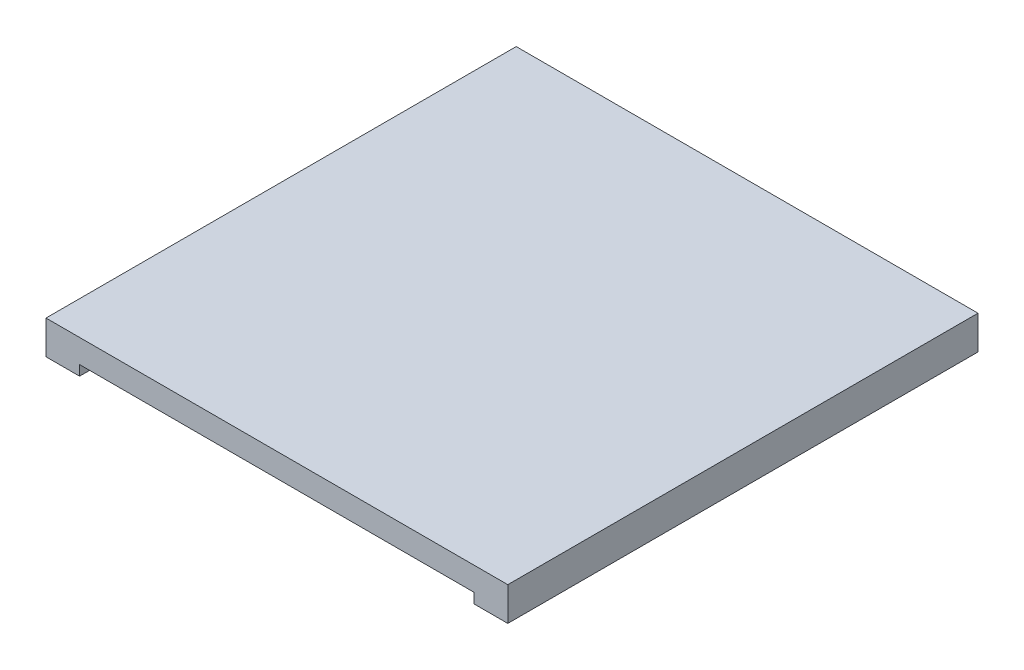
ISO-10303-21;
HEADER;
FILE_DESCRIPTION(('STEP AP214'),'2;1');
FILE_NAME('part.step','',(''),(''),'','','');
FILE_SCHEMA(('AUTOMOTIVE_DESIGN { 1 0 10303 214 1 1 1 1 }'));
ENDSEC;
DATA;
#1=APPLICATION_CONTEXT('core data for automotive mechanical design processes');
#2=APPLICATION_PROTOCOL_DEFINITION('international standard','automotive_design',2000,#1);
#3=PRODUCT_CONTEXT('',#1,'mechanical');
#4=PRODUCT('Part','Part','',(#3));
#5=PRODUCT_RELATED_PRODUCT_CATEGORY('part','',(#4));
#6=PRODUCT_DEFINITION_FORMATION('','',#4);
#7=PRODUCT_DEFINITION_CONTEXT('part definition',#1,'design');
#8=PRODUCT_DEFINITION('design','',#6,#7);
#9=PRODUCT_DEFINITION_SHAPE('','',#8);
#10=(LENGTH_UNIT() NAMED_UNIT(*) SI_UNIT(.MILLI.,.METRE.));
#11=(NAMED_UNIT(*) PLANE_ANGLE_UNIT() SI_UNIT($,.RADIAN.));
#12=(NAMED_UNIT(*) SI_UNIT($,.STERADIAN.) SOLID_ANGLE_UNIT());
#13=UNCERTAINTY_MEASURE_WITH_UNIT(LENGTH_MEASURE(1.E-05),#10,'distance_accuracy_value','');
#14=(GEOMETRIC_REPRESENTATION_CONTEXT(3) GLOBAL_UNCERTAINTY_ASSIGNED_CONTEXT((#13)) GLOBAL_UNIT_ASSIGNED_CONTEXT((#10,
#11,#12)) REPRESENTATION_CONTEXT('',''));
#15=CARTESIAN_POINT('',(0.,0.,0.));
#16=DIRECTION('',(0.,0.,1.));
#17=DIRECTION('',(1.,0.,0.));
#18=AXIS2_PLACEMENT_3D('',#15,#16,#17);
#19=CARTESIAN_POINT('',(29.6925271830558,0.,0.));
#20=DIRECTION('',(0.,0.,-1.));
#21=DIRECTION('',(-1.,0.,0.));
#22=AXIS2_PLACEMENT_3D('',#19,#20,#21);
#23=PLANE('',#22);
#24=DIRECTION('',(1.,0.,0.));
#25=VECTOR('',#24,1.);
#26=CARTESIAN_POINT('',(-8.05,7.5,0.));
#27=LINE('',#26,#25);
#28=CARTESIAN_POINT('',(-8.05,7.5,0.));
#29=VERTEX_POINT('',#28);
#30=CARTESIAN_POINT('',(19.45,7.5,0.));
#31=VERTEX_POINT('',#30);
#32=EDGE_CURVE('E141',#29,#31,#27,.T.);
#33=ORIENTED_EDGE('',*,*,#32,.F.);
#34=DIRECTION('',(0.,-1.,0.));
#35=VECTOR('',#34,1.);
#36=CARTESIAN_POINT('',(-8.05,7.5,0.));
#37=LINE('',#36,#35);
#38=CARTESIAN_POINT('',(-8.05,5.49999999996393,0.));
#39=VERTEX_POINT('',#38);
#40=EDGE_CURVE('E147',#29,#39,#37,.T.);
#41=ORIENTED_EDGE('',*,*,#40,.T.);
#42=DIRECTION('',(1.,0.,0.));
#43=VECTOR('',#42,1.);
#44=CARTESIAN_POINT('',(-4.05000000000001,5.5,0.));
#45=LINE('',#44,#43);
#46=CARTESIAN_POINT('',(-6.05000000000001,5.5,0.));
#47=VERTEX_POINT('',#46);
#48=EDGE_CURVE('E51',#39,#47,#45,.T.);
#49=ORIENTED_EDGE('',*,*,#48,.T.);
#50=DIRECTION('',(0.,1.,0.));
#51=VECTOR('',#50,1.);
#52=CARTESIAN_POINT('',(-6.05000000000001,-6.1,0.));
#53=LINE('',#52,#51);
#54=CARTESIAN_POINT('',(-6.05000000000001,6.1,0.));
#55=VERTEX_POINT('',#54);
#56=EDGE_CURVE('E158',#47,#55,#53,.T.);
#57=ORIENTED_EDGE('',*,*,#56,.T.);
#58=DIRECTION('',(-1.,0.,0.));
#59=VECTOR('',#58,1.);
#60=CARTESIAN_POINT('',(0.,6.1,0.));
#61=LINE('',#60,#59);
#62=CARTESIAN_POINT('',(17.45,6.1,0.));
#63=VERTEX_POINT('',#62);
#64=EDGE_CURVE('E157',#63,#55,#61,.T.);
#65=ORIENTED_EDGE('',*,*,#64,.F.);
#66=DIRECTION('',(0.,1.,0.));
#67=VECTOR('',#66,1.);
#68=CARTESIAN_POINT('',(17.45,-6.1,0.));
#69=LINE('',#68,#67);
#70=CARTESIAN_POINT('',(17.45,5.5,0.));
#71=VERTEX_POINT('',#70);
#72=EDGE_CURVE('E120',#71,#63,#69,.T.);
#73=ORIENTED_EDGE('',*,*,#72,.F.);
#74=CARTESIAN_POINT('',(19.45,5.49999999996393,0.));
#75=VERTEX_POINT('',#74);
#76=EDGE_CURVE('E12',#71,#75,#45,.T.);
#77=ORIENTED_EDGE('',*,*,#76,.T.);
#78=DIRECTION('',(0.,-1.,0.));
#79=VECTOR('',#78,1.);
#80=CARTESIAN_POINT('',(19.45,7.5,0.));
#81=LINE('',#80,#79);
#82=EDGE_CURVE('E144',#31,#75,#81,.T.);
#83=ORIENTED_EDGE('',*,*,#82,.F.);
#84=EDGE_LOOP('',(#33,#41,#49,#57,#65,#73,#77,#83));
#85=FACE_BOUND('',#84,.T.);
#86=ADVANCED_FACE('F43',(#85),#23,.F.);
#87=CARTESIAN_POINT('',(-6.05000000000001,-6.1,-25.3977601989736));
#88=DIRECTION('',(0.,0.,1.));
#89=DIRECTION('',(1.,0.,0.));
#90=AXIS2_PLACEMENT_3D('',#87,#88,#89);
#91=PLANE('',#90);
#92=DIRECTION('',(0.,1.,0.));
#93=VECTOR('',#92,1.);
#94=CARTESIAN_POINT('',(-6.05000000000001,-6.1,-25.3977601989736));
#95=LINE('',#94,#93);
#96=CARTESIAN_POINT('',(-6.05000000000001,5.5,-25.3977601989736));
#97=VERTEX_POINT('',#96);
#98=CARTESIAN_POINT('',(-6.05000000000001,6.1,-25.3977601989736));
#99=VERTEX_POINT('',#98);
#100=EDGE_CURVE('E114',#97,#99,#95,.T.);
#101=ORIENTED_EDGE('',*,*,#100,.F.);
#102=DIRECTION('',(-1.,0.,0.));
#103=VECTOR('',#102,1.);
#104=CARTESIAN_POINT('',(-6.05000000000001,5.5,-25.3977601989736));
#105=LINE('',#104,#103);
#106=CARTESIAN_POINT('',(17.45,5.5,-25.3977601989736));
#107=VERTEX_POINT('',#106);
#108=EDGE_CURVE('E59',#107,#97,#105,.T.);
#109=ORIENTED_EDGE('',*,*,#108,.F.);
#110=DIRECTION('',(0.,1.,0.));
#111=VECTOR('',#110,1.);
#112=CARTESIAN_POINT('',(17.45,-6.1,-25.3977601989736));
#113=LINE('',#112,#111);
#114=CARTESIAN_POINT('',(17.45,6.1,-25.3977601989736));
#115=VERTEX_POINT('',#114);
#116=EDGE_CURVE('E107',#107,#115,#113,.T.);
#117=ORIENTED_EDGE('',*,*,#116,.T.);
#118=DIRECTION('',(1.,0.,0.));
#119=VECTOR('',#118,1.);
#120=CARTESIAN_POINT('',(-6.05000000000001,6.1,-25.3977601989736));
#121=LINE('',#120,#119);
#122=EDGE_CURVE('E111',#99,#115,#121,.T.);
#123=ORIENTED_EDGE('',*,*,#122,.F.);
#124=EDGE_LOOP('',(#101,#109,#117,#123));
#125=FACE_BOUND('',#124,.T.);
#126=ADVANCED_FACE('F109',(#125),#91,.T.);
#127=CARTESIAN_POINT('',(-6.05000000000001,-6.1,0.0522398010264304));
#128=DIRECTION('',(1.,0.,0.));
#129=DIRECTION('',(0.,0.,-1.));
#130=AXIS2_PLACEMENT_3D('',#127,#128,#129);
#131=PLANE('',#130);
#132=ORIENTED_EDGE('',*,*,#56,.F.);
#133=DIRECTION('',(0.,0.,-1.));
#134=VECTOR('',#133,1.);
#135=CARTESIAN_POINT('',(-6.05000000000001,5.5,0.0522398010264304));
#136=LINE('',#135,#134);
#137=EDGE_CURVE('E162',#47,#97,#136,.T.);
#138=ORIENTED_EDGE('',*,*,#137,.T.);
#139=ORIENTED_EDGE('',*,*,#100,.T.);
#140=DIRECTION('',(0.,0.,-1.));
#141=VECTOR('',#140,1.);
#142=CARTESIAN_POINT('',(-6.05000000000001,6.1,0.0522398010264304));
#143=LINE('',#142,#141);
#144=EDGE_CURVE('E115',#55,#99,#143,.T.);
#145=ORIENTED_EDGE('',*,*,#144,.F.);
#146=EDGE_LOOP('',(#132,#138,#139,#145));
#147=FACE_BOUND('',#146,.T.);
#148=ADVANCED_FACE('F186',(#147),#131,.T.);
#149=CARTESIAN_POINT('',(17.45,-6.1,0.0522398010264291));
#150=DIRECTION('',(1.,0.,0.));
#151=DIRECTION('',(0.,0.,-1.));
#152=AXIS2_PLACEMENT_3D('',#149,#150,#151);
#153=PLANE('',#152);
#154=DIRECTION('',(0.,0.,-1.));
#155=VECTOR('',#154,1.);
#156=CARTESIAN_POINT('',(17.45,5.5,0.0522398010264291));
#157=LINE('',#156,#155);
#158=EDGE_CURVE('E150',#71,#107,#157,.T.);
#159=ORIENTED_EDGE('',*,*,#158,.F.);
#160=ORIENTED_EDGE('',*,*,#72,.T.);
#161=DIRECTION('',(0.,0.,-1.));
#162=VECTOR('',#161,1.);
#163=CARTESIAN_POINT('',(17.45,6.1,0.0522398010264291));
#164=LINE('',#163,#162);
#165=EDGE_CURVE('E118',#63,#115,#164,.T.);
#166=ORIENTED_EDGE('',*,*,#165,.T.);
#167=ORIENTED_EDGE('',*,*,#116,.F.);
#168=EDGE_LOOP('',(#159,#160,#166,#167));
#169=FACE_BOUND('',#168,.T.);
#170=ADVANCED_FACE('F119',(#169),#153,.F.);
#171=CARTESIAN_POINT('',(0.,6.1,0.));
#172=DIRECTION('',(0.,1.,0.));
#173=DIRECTION('',(0.,0.,1.));
#174=AXIS2_PLACEMENT_3D('',#171,#172,#173);
#175=PLANE('',#174);
#176=ORIENTED_EDGE('',*,*,#165,.F.);
#177=ORIENTED_EDGE('',*,*,#64,.T.);
#178=ORIENTED_EDGE('',*,*,#144,.T.);
#179=ORIENTED_EDGE('',*,*,#122,.T.);
#180=EDGE_LOOP('',(#176,#177,#178,#179));
#181=FACE_BOUND('',#180,.T.);
#182=ADVANCED_FACE('F126',(#181),#175,.F.);
#183=CARTESIAN_POINT('',(-4.05000000000001,5.5,-25.));
#184=DIRECTION('',(0.,1.,0.));
#185=DIRECTION('',(-1.,0.,0.));
#186=AXIS2_PLACEMENT_3D('',#183,#184,#185);
#187=PLANE('',#186);
#188=ORIENTED_EDGE('',*,*,#108,.T.);
#189=ORIENTED_EDGE('',*,*,#137,.F.);
#190=ORIENTED_EDGE('',*,*,#48,.F.);
#191=DIRECTION('',(0.,0.,-1.));
#192=VECTOR('',#191,1.);
#193=CARTESIAN_POINT('',(-8.05,5.5,-28.));
#194=LINE('',#193,#192);
#195=CARTESIAN_POINT('',(-8.05,5.5,-28.));
#196=VERTEX_POINT('',#195);
#197=EDGE_CURVE('E46',#39,#196,#194,.T.);
#198=ORIENTED_EDGE('',*,*,#197,.T.);
#199=DIRECTION('',(1.,0.,0.));
#200=VECTOR('',#199,1.);
#201=CARTESIAN_POINT('',(-4.05000000000001,5.5,-28.));
#202=LINE('',#201,#200);
#203=CARTESIAN_POINT('',(19.45,5.5,-28.));
#204=VERTEX_POINT('',#203);
#205=EDGE_CURVE('E123',#196,#204,#202,.T.);
#206=ORIENTED_EDGE('',*,*,#205,.T.);
#207=DIRECTION('',(0.,0.,1.));
#208=VECTOR('',#207,1.);
#209=CARTESIAN_POINT('',(19.45,5.5,-28.));
#210=LINE('',#209,#208);
#211=EDGE_CURVE('E166',#204,#75,#210,.T.);
#212=ORIENTED_EDGE('',*,*,#211,.T.);
#213=ORIENTED_EDGE('',*,*,#76,.F.);
#214=ORIENTED_EDGE('',*,*,#158,.T.);
#215=EDGE_LOOP('',(#188,#189,#190,#198,#206,#212,#213,#214));
#216=FACE_BOUND('',#215,.T.);
#217=ADVANCED_FACE('F170',(#216),#187,.F.);
#218=CARTESIAN_POINT('',(-8.05,7.5,-28.));
#219=DIRECTION('',(0.,0.,1.));
#220=DIRECTION('',(1.,0.,0.));
#221=AXIS2_PLACEMENT_3D('',#218,#219,#220);
#222=PLANE('',#221);
#223=ORIENTED_EDGE('',*,*,#205,.F.);
#224=DIRECTION('',(0.,-1.,0.));
#225=VECTOR('',#224,1.);
#226=CARTESIAN_POINT('',(-8.05,7.5,-28.));
#227=LINE('',#226,#225);
#228=CARTESIAN_POINT('',(-8.05,7.5,-28.));
#229=VERTEX_POINT('',#228);
#230=EDGE_CURVE('E146',#229,#196,#227,.T.);
#231=ORIENTED_EDGE('',*,*,#230,.F.);
#232=DIRECTION('',(-1.,0.,0.));
#233=VECTOR('',#232,1.);
#234=CARTESIAN_POINT('',(-8.05,7.5,-28.));
#235=LINE('',#234,#233);
#236=CARTESIAN_POINT('',(19.45,7.5,-28.));
#237=VERTEX_POINT('',#236);
#238=EDGE_CURVE('E136',#237,#229,#235,.T.);
#239=ORIENTED_EDGE('',*,*,#238,.F.);
#240=DIRECTION('',(0.,-1.,0.));
#241=VECTOR('',#240,1.);
#242=CARTESIAN_POINT('',(19.45,7.5,-28.));
#243=LINE('',#242,#241);
#244=EDGE_CURVE('E153',#237,#204,#243,.T.);
#245=ORIENTED_EDGE('',*,*,#244,.T.);
#246=EDGE_LOOP('',(#223,#231,#239,#245));
#247=FACE_BOUND('',#246,.T.);
#248=ADVANCED_FACE('F179',(#247),#222,.F.);
#249=CARTESIAN_POINT('',(19.45,7.5,-28.));
#250=DIRECTION('',(-1.,0.,0.));
#251=DIRECTION('',(0.,0.,1.));
#252=AXIS2_PLACEMENT_3D('',#249,#250,#251);
#253=PLANE('',#252);
#254=ORIENTED_EDGE('',*,*,#211,.F.);
#255=ORIENTED_EDGE('',*,*,#244,.F.);
#256=DIRECTION('',(0.,0.,-1.));
#257=VECTOR('',#256,1.);
#258=CARTESIAN_POINT('',(19.45,7.5,-28.));
#259=LINE('',#258,#257);
#260=EDGE_CURVE('E132',#31,#237,#259,.T.);
#261=ORIENTED_EDGE('',*,*,#260,.F.);
#262=ORIENTED_EDGE('',*,*,#82,.T.);
#263=EDGE_LOOP('',(#254,#255,#261,#262));
#264=FACE_BOUND('',#263,.T.);
#265=ADVANCED_FACE('F183',(#264),#253,.F.);
#266=CARTESIAN_POINT('',(-8.05,7.5,-28.));
#267=DIRECTION('',(1.,0.,0.));
#268=DIRECTION('',(0.,0.,-1.));
#269=AXIS2_PLACEMENT_3D('',#266,#267,#268);
#270=PLANE('',#269);
#271=ORIENTED_EDGE('',*,*,#197,.F.);
#272=ORIENTED_EDGE('',*,*,#40,.F.);
#273=DIRECTION('',(0.,0.,1.));
#274=VECTOR('',#273,1.);
#275=CARTESIAN_POINT('',(-8.05,7.5,-28.));
#276=LINE('',#275,#274);
#277=EDGE_CURVE('E138',#229,#29,#276,.T.);
#278=ORIENTED_EDGE('',*,*,#277,.F.);
#279=ORIENTED_EDGE('',*,*,#230,.T.);
#280=EDGE_LOOP('',(#271,#272,#278,#279));
#281=FACE_BOUND('',#280,.T.);
#282=ADVANCED_FACE('F174',(#281),#270,.F.);
#283=CARTESIAN_POINT('',(0.,7.5,0.));
#284=DIRECTION('',(0.,1.,0.));
#285=DIRECTION('',(0.,0.,1.));
#286=AXIS2_PLACEMENT_3D('',#283,#284,#285);
#287=PLANE('',#286);
#288=ORIENTED_EDGE('',*,*,#260,.T.);
#289=ORIENTED_EDGE('',*,*,#238,.T.);
#290=ORIENTED_EDGE('',*,*,#277,.T.);
#291=ORIENTED_EDGE('',*,*,#32,.T.);
#292=EDGE_LOOP('',(#288,#289,#290,#291));
#293=FACE_BOUND('',#292,.T.);
#294=ADVANCED_FACE('F188',(#293),#287,.T.);
#295=CLOSED_SHELL('',(#86,#126,#148,#170,#182,#217,#248,#265,#282,#294));
#296=MANIFOLD_SOLID_BREP('B2',#295);
#297=ADVANCED_BREP_SHAPE_REPRESENTATION('',(#18,#296),#14);
#298=SHAPE_DEFINITION_REPRESENTATION(#9,#297);
ENDSEC;
END-ISO-10303-21;
